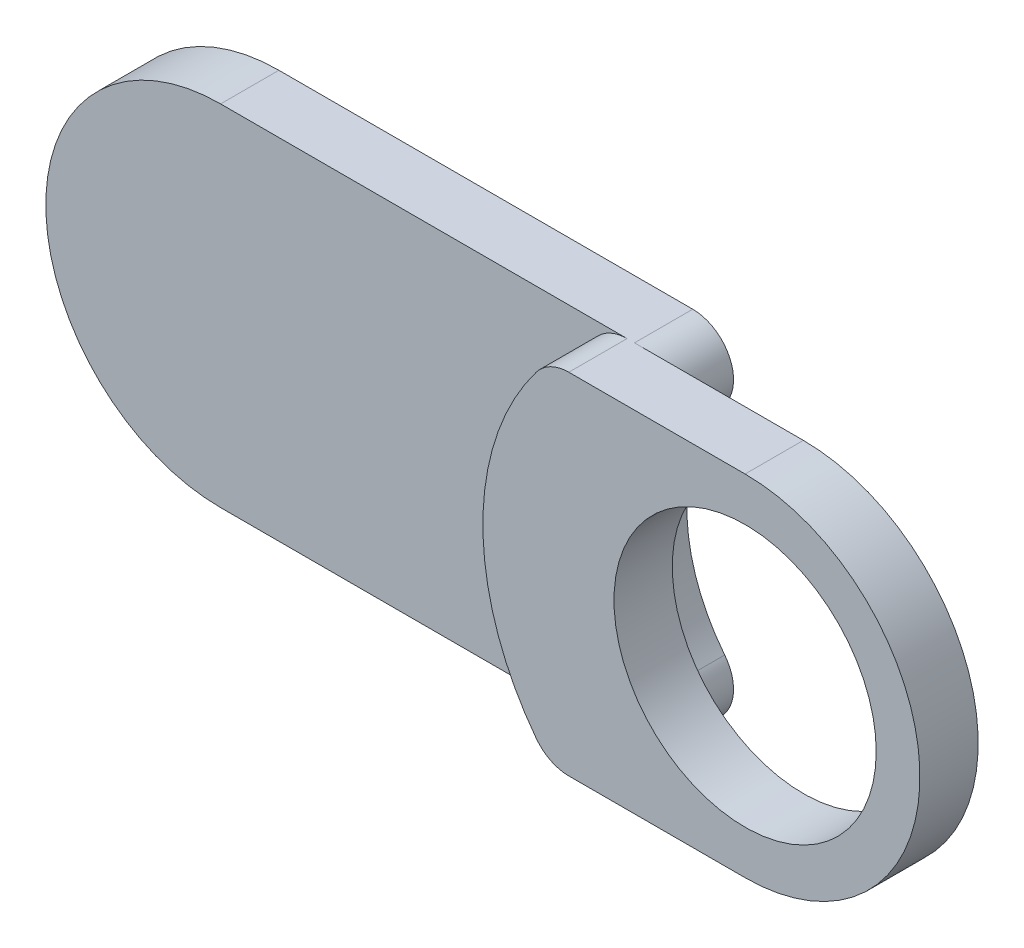
ISO-10303-21;
HEADER;
FILE_DESCRIPTION(('STEP AP214'),'2;1');
FILE_NAME('part.step','',(''),(''),'','','');
FILE_SCHEMA(('AUTOMOTIVE_DESIGN { 1 0 10303 214 1 1 1 1 }'));
ENDSEC;
DATA;
#1=APPLICATION_CONTEXT('core data for automotive mechanical design processes');
#2=APPLICATION_PROTOCOL_DEFINITION('international standard','automotive_design',2000,#1);
#3=PRODUCT_CONTEXT('',#1,'mechanical');
#4=PRODUCT('Part','Part','',(#3));
#5=PRODUCT_RELATED_PRODUCT_CATEGORY('part','',(#4));
#6=PRODUCT_DEFINITION_FORMATION('','',#4);
#7=PRODUCT_DEFINITION_CONTEXT('part definition',#1,'design');
#8=PRODUCT_DEFINITION('design','',#6,#7);
#9=PRODUCT_DEFINITION_SHAPE('','',#8);
#10=(LENGTH_UNIT() NAMED_UNIT(*) SI_UNIT(.MILLI.,.METRE.));
#11=(NAMED_UNIT(*) PLANE_ANGLE_UNIT() SI_UNIT($,.RADIAN.));
#12=(NAMED_UNIT(*) SI_UNIT($,.STERADIAN.) SOLID_ANGLE_UNIT());
#13=UNCERTAINTY_MEASURE_WITH_UNIT(LENGTH_MEASURE(1.E-05),#10,'distance_accuracy_value','');
#14=(GEOMETRIC_REPRESENTATION_CONTEXT(3) GLOBAL_UNCERTAINTY_ASSIGNED_CONTEXT((#13)) GLOBAL_UNIT_ASSIGNED_CONTEXT((#10,
#11,#12)) REPRESENTATION_CONTEXT('',''));
#15=CARTESIAN_POINT('',(0.,0.,0.));
#16=DIRECTION('',(0.,0.,1.));
#17=DIRECTION('',(1.,0.,0.));
#18=AXIS2_PLACEMENT_3D('',#15,#16,#17);
#19=CARTESIAN_POINT('',(0.,0.,1.));
#20=DIRECTION('',(0.,0.,1.));
#21=DIRECTION('',(1.,0.,0.));
#22=AXIS2_PLACEMENT_3D('',#19,#20,#21);
#23=PLANE('',#22);
#24=CARTESIAN_POINT('',(0.,0.,1.));
#25=DIRECTION('',(0.,0.,1.));
#26=DIRECTION('',(1.,0.,0.));
#27=AXIS2_PLACEMENT_3D('',#24,#25,#26);
#28=CIRCLE('',#27,2.25);
#29=CARTESIAN_POINT('',(2.25,0.,1.));
#30=VERTEX_POINT('',#29);
#31=EDGE_CURVE('E153',#30,#30,#28,.T.);
#32=ORIENTED_EDGE('',*,*,#31,.F.);
#33=EDGE_LOOP('',(#32));
#34=FACE_BOUND('',#33,.T.);
#35=CARTESIAN_POINT('',(0.,0.,1.));
#36=DIRECTION('',(0.,0.,1.));
#37=DIRECTION('',(-1.,0.,0.));
#38=AXIS2_PLACEMENT_3D('',#35,#36,#37);
#39=CIRCLE('',#38,4.5);
#40=CARTESIAN_POINT('',(-3.58211450421809,2.72368421052632,1.));
#41=VERTEX_POINT('',#40);
#42=CARTESIAN_POINT('',(-3.58211450421809,-2.72368421052632,1.));
#43=VERTEX_POINT('',#42);
#44=EDGE_CURVE('E211',#41,#43,#39,.T.);
#45=ORIENTED_EDGE('',*,*,#44,.T.);
#46=CARTESIAN_POINT('',(-3.02489669245083,-2.3,1.));
#47=DIRECTION('',(0.,0.,1.));
#48=DIRECTION('',(1.,0.,0.));
#49=AXIS2_PLACEMENT_3D('',#46,#47,#48);
#50=CIRCLE('',#49,0.7);
#51=CARTESIAN_POINT('',(-3.02489669245083,-3.,1.));
#52=VERTEX_POINT('',#51);
#53=EDGE_CURVE('E195',#43,#52,#50,.T.);
#54=ORIENTED_EDGE('',*,*,#53,.T.);
#55=DIRECTION('',(-1.,0.,0.));
#56=VECTOR('',#55,1.);
#57=CARTESIAN_POINT('',(0.,-3.,1.));
#58=LINE('',#57,#56);
#59=CARTESIAN_POINT('',(0.,-3.,1.));
#60=VERTEX_POINT('',#59);
#61=EDGE_CURVE('E216',#60,#52,#58,.T.);
#62=ORIENTED_EDGE('',*,*,#61,.F.);
#63=CARTESIAN_POINT('',(0.,0.,1.));
#64=DIRECTION('',(0.,0.,1.));
#65=DIRECTION('',(1.,0.,0.));
#66=AXIS2_PLACEMENT_3D('',#63,#64,#65);
#67=CIRCLE('',#66,3.);
#68=CARTESIAN_POINT('',(0.,3.,1.));
#69=VERTEX_POINT('',#68);
#70=EDGE_CURVE('E159',#60,#69,#67,.T.);
#71=ORIENTED_EDGE('',*,*,#70,.T.);
#72=DIRECTION('',(1.,0.,0.));
#73=VECTOR('',#72,1.);
#74=CARTESIAN_POINT('',(0.,3.,1.));
#75=LINE('',#74,#73);
#76=CARTESIAN_POINT('',(-3.02489669245083,3.,1.));
#77=VERTEX_POINT('',#76);
#78=EDGE_CURVE('E152',#77,#69,#75,.T.);
#79=ORIENTED_EDGE('',*,*,#78,.F.);
#80=CARTESIAN_POINT('',(-3.02489669245083,2.3,1.));
#81=DIRECTION('',(0.,0.,1.));
#82=DIRECTION('',(1.,0.,0.));
#83=AXIS2_PLACEMENT_3D('',#80,#81,#82);
#84=CIRCLE('',#83,0.7);
#85=EDGE_CURVE('E193',#77,#41,#84,.T.);
#86=ORIENTED_EDGE('',*,*,#85,.T.);
#87=EDGE_LOOP('',(#45,#54,#62,#71,#79,#86));
#88=FACE_BOUND('',#87,.T.);
#89=ADVANCED_FACE('F33',(#34,#88),#23,.T.);
#90=CARTESIAN_POINT('',(0.,3.,1.));
#91=DIRECTION('',(0.,1.,0.));
#92=DIRECTION('',(-1.,0.,0.));
#93=AXIS2_PLACEMENT_3D('',#90,#91,#92);
#94=PLANE('',#93);
#95=DIRECTION('',(1.,0.,0.));
#96=VECTOR('',#95,1.);
#97=CARTESIAN_POINT('',(-10.,3.,0.));
#98=LINE('',#97,#96);
#99=CARTESIAN_POINT('',(-10.,3.,0.));
#100=VERTEX_POINT('',#99);
#101=CARTESIAN_POINT('',(-3.02489669245083,3.,0.));
#102=VERTEX_POINT('',#101);
#103=EDGE_CURVE('E48',#100,#102,#98,.T.);
#104=ORIENTED_EDGE('',*,*,#103,.T.);
#105=DIRECTION('',(0.,0.,1.));
#106=VECTOR('',#105,1.);
#107=CARTESIAN_POINT('',(-3.02489669245083,3.,1.));
#108=LINE('',#107,#106);
#109=EDGE_CURVE('E199',#102,#77,#108,.T.);
#110=ORIENTED_EDGE('',*,*,#109,.T.);
#111=ORIENTED_EDGE('',*,*,#78,.T.);
#112=DIRECTION('',(0.,0.,-1.));
#113=VECTOR('',#112,1.);
#114=CARTESIAN_POINT('',(0.,3.,1.));
#115=LINE('',#114,#113);
#116=CARTESIAN_POINT('',(0.,3.,0.));
#117=VERTEX_POINT('',#116);
#118=EDGE_CURVE('E141',#69,#117,#115,.T.);
#119=ORIENTED_EDGE('',*,*,#118,.T.);
#120=DIRECTION('',(-1.,0.,0.));
#121=VECTOR('',#120,1.);
#122=CARTESIAN_POINT('',(0.,3.,0.));
#123=LINE('',#122,#121);
#124=CARTESIAN_POINT('',(-2.89827534923789,3.,0.));
#125=VERTEX_POINT('',#124);
#126=EDGE_CURVE('E179',#117,#125,#123,.T.);
#127=ORIENTED_EDGE('',*,*,#126,.T.);
#128=DIRECTION('',(0.,0.,-1.));
#129=VECTOR('',#128,1.);
#130=CARTESIAN_POINT('',(-2.89827534923789,3.,1.));
#131=LINE('',#130,#129);
#132=CARTESIAN_POINT('',(-2.89827534923789,3.,-1.));
#133=VERTEX_POINT('',#132);
#134=EDGE_CURVE('E182',#125,#133,#131,.T.);
#135=ORIENTED_EDGE('',*,*,#134,.T.);
#136=DIRECTION('',(1.,0.,0.));
#137=VECTOR('',#136,1.);
#138=CARTESIAN_POINT('',(0.,3.,-1.));
#139=LINE('',#138,#137);
#140=CARTESIAN_POINT('',(-10.,3.,-1.));
#141=VERTEX_POINT('',#140);
#142=EDGE_CURVE('E140',#141,#133,#139,.T.);
#143=ORIENTED_EDGE('',*,*,#142,.F.);
#144=DIRECTION('',(0.,0.,-1.));
#145=VECTOR('',#144,1.);
#146=CARTESIAN_POINT('',(-10.,3.,1.));
#147=LINE('',#146,#145);
#148=EDGE_CURVE('E131',#100,#141,#147,.T.);
#149=ORIENTED_EDGE('',*,*,#148,.F.);
#150=EDGE_LOOP('',(#104,#110,#111,#119,#127,#135,#143,#149));
#151=FACE_BOUND('',#150,.T.);
#152=ADVANCED_FACE('F137',(#151),#94,.T.);
#153=CARTESIAN_POINT('',(0.,-3.,1.));
#154=DIRECTION('',(0.,-1.,0.));
#155=DIRECTION('',(0.,0.,-1.));
#156=AXIS2_PLACEMENT_3D('',#153,#154,#155);
#157=PLANE('',#156);
#158=ORIENTED_EDGE('',*,*,#61,.T.);
#159=DIRECTION('',(0.,0.,1.));
#160=VECTOR('',#159,1.);
#161=CARTESIAN_POINT('',(-3.02489669245083,-3.,1.));
#162=LINE('',#161,#160);
#163=CARTESIAN_POINT('',(-3.02489669245083,-3.,0.));
#164=VERTEX_POINT('',#163);
#165=EDGE_CURVE('E197',#52,#164,#162,.F.);
#166=ORIENTED_EDGE('',*,*,#165,.T.);
#167=DIRECTION('',(-1.,0.,0.));
#168=VECTOR('',#167,1.);
#169=CARTESIAN_POINT('',(-3.35410196624968,-3.,0.));
#170=LINE('',#169,#168);
#171=CARTESIAN_POINT('',(-10.,-3.,0.));
#172=VERTEX_POINT('',#171);
#173=EDGE_CURVE('E55',#164,#172,#170,.T.);
#174=ORIENTED_EDGE('',*,*,#173,.T.);
#175=DIRECTION('',(0.,0.,-1.));
#176=VECTOR('',#175,1.);
#177=CARTESIAN_POINT('',(-10.,-3.,1.));
#178=LINE('',#177,#176);
#179=CARTESIAN_POINT('',(-10.,-3.,-1.));
#180=VERTEX_POINT('',#179);
#181=EDGE_CURVE('E134',#172,#180,#178,.T.);
#182=ORIENTED_EDGE('',*,*,#181,.T.);
#183=DIRECTION('',(-1.,0.,0.));
#184=VECTOR('',#183,1.);
#185=CARTESIAN_POINT('',(0.,-3.,-1.));
#186=LINE('',#185,#184);
#187=CARTESIAN_POINT('',(-2.89827534923789,-3.,-1.));
#188=VERTEX_POINT('',#187);
#189=EDGE_CURVE('E226',#188,#180,#186,.T.);
#190=ORIENTED_EDGE('',*,*,#189,.F.);
#191=DIRECTION('',(0.,0.,-1.));
#192=VECTOR('',#191,1.);
#193=CARTESIAN_POINT('',(-2.89827534923789,-3.,1.));
#194=LINE('',#193,#192);
#195=CARTESIAN_POINT('',(-2.89827534923789,-3.,0.));
#196=VERTEX_POINT('',#195);
#197=EDGE_CURVE('E176',#188,#196,#194,.F.);
#198=ORIENTED_EDGE('',*,*,#197,.T.);
#199=DIRECTION('',(1.,0.,0.));
#200=VECTOR('',#199,1.);
#201=CARTESIAN_POINT('',(0.,-3.,0.));
#202=LINE('',#201,#200);
#203=CARTESIAN_POINT('',(0.,-3.,0.));
#204=VERTEX_POINT('',#203);
#205=EDGE_CURVE('E174',#196,#204,#202,.T.);
#206=ORIENTED_EDGE('',*,*,#205,.T.);
#207=DIRECTION('',(0.,0.,-1.));
#208=VECTOR('',#207,1.);
#209=CARTESIAN_POINT('',(0.,-3.,1.));
#210=LINE('',#209,#208);
#211=EDGE_CURVE('E146',#60,#204,#210,.T.);
#212=ORIENTED_EDGE('',*,*,#211,.F.);
#213=EDGE_LOOP('',(#158,#166,#174,#182,#190,#198,#206,#212));
#214=FACE_BOUND('',#213,.T.);
#215=ADVANCED_FACE('F219',(#214),#157,.T.);
#216=CARTESIAN_POINT('',(0.,0.,1.));
#217=DIRECTION('',(0.,0.,-1.));
#218=DIRECTION('',(-1.,0.,0.));
#219=AXIS2_PLACEMENT_3D('',#216,#217,#218);
#220=CYLINDRICAL_SURFACE('',#219,3.);
#221=ORIENTED_EDGE('',*,*,#118,.F.);
#222=ORIENTED_EDGE('',*,*,#70,.F.);
#223=ORIENTED_EDGE('',*,*,#211,.T.);
#224=CARTESIAN_POINT('',(0.,0.,0.));
#225=DIRECTION('',(0.,0.,1.));
#226=DIRECTION('',(1.,0.,0.));
#227=AXIS2_PLACEMENT_3D('',#224,#225,#226);
#228=CIRCLE('',#227,3.);
#229=EDGE_CURVE('E156',#204,#117,#228,.T.);
#230=ORIENTED_EDGE('',*,*,#229,.T.);
#231=EDGE_LOOP('',(#221,#222,#223,#230));
#232=FACE_BOUND('',#231,.T.);
#233=ADVANCED_FACE('F255',(#232),#220,.T.);
#234=CARTESIAN_POINT('',(0.,0.,0.));
#235=DIRECTION('',(0.,0.,1.));
#236=DIRECTION('',(1.,0.,0.));
#237=AXIS2_PLACEMENT_3D('',#234,#235,#236);
#238=PLANE('',#237);
#239=CARTESIAN_POINT('',(-2.34995298586856,1.86486486486486,0.));
#240=VERTEX_POINT('',#239);
#241=CARTESIAN_POINT('',(-2.34995298586856,-1.86486486486486,0.));
#242=VERTEX_POINT('',#241);
#243=EDGE_CURVE('E163',#240,#242,#228,.T.);
#244=ORIENTED_EDGE('',*,*,#243,.F.);
#245=CARTESIAN_POINT('',(-2.89827534923789,2.3,0.));
#246=DIRECTION('',(0.,0.,1.));
#247=DIRECTION('',(1.,0.,0.));
#248=AXIS2_PLACEMENT_3D('',#245,#246,#247);
#249=CIRCLE('',#248,0.7);
#250=EDGE_CURVE('E186',#240,#125,#249,.T.);
#251=ORIENTED_EDGE('',*,*,#250,.T.);
#252=ORIENTED_EDGE('',*,*,#126,.F.);
#253=ORIENTED_EDGE('',*,*,#229,.F.);
#254=ORIENTED_EDGE('',*,*,#205,.F.);
#255=CARTESIAN_POINT('',(-2.89827534923789,-2.3,0.));
#256=DIRECTION('',(0.,0.,1.));
#257=DIRECTION('',(1.,0.,0.));
#258=AXIS2_PLACEMENT_3D('',#255,#256,#257);
#259=CIRCLE('',#258,0.7);
#260=EDGE_CURVE('E184',#196,#242,#259,.T.);
#261=ORIENTED_EDGE('',*,*,#260,.T.);
#262=EDGE_LOOP('',(#244,#251,#252,#253,#254,#261));
#263=FACE_BOUND('',#262,.T.);
#264=CARTESIAN_POINT('',(0.,0.,0.));
#265=DIRECTION('',(0.,0.,1.));
#266=DIRECTION('',(1.,0.,0.));
#267=AXIS2_PLACEMENT_3D('',#264,#265,#266);
#268=CIRCLE('',#267,2.25);
#269=CARTESIAN_POINT('',(2.25,0.,0.));
#270=VERTEX_POINT('',#269);
#271=EDGE_CURVE('E144',#270,#270,#268,.T.);
#272=ORIENTED_EDGE('',*,*,#271,.T.);
#273=EDGE_LOOP('',(#272));
#274=FACE_BOUND('',#273,.T.);
#275=ADVANCED_FACE('F246',(#263,#274),#238,.F.);
#276=CARTESIAN_POINT('',(0.,0.,1.));
#277=DIRECTION('',(0.,0.,-1.));
#278=DIRECTION('',(-1.,0.,0.));
#279=AXIS2_PLACEMENT_3D('',#276,#277,#278);
#280=CYLINDRICAL_SURFACE('',#279,2.25);
#281=ORIENTED_EDGE('',*,*,#31,.T.);
#282=EDGE_LOOP('',(#281));
#283=FACE_BOUND('',#282,.T.);
#284=ORIENTED_EDGE('',*,*,#271,.F.);
#285=EDGE_LOOP('',(#284));
#286=FACE_BOUND('',#285,.T.);
#287=ADVANCED_FACE('F273',(#283,#286),#280,.F.);
#288=CARTESIAN_POINT('',(0.,0.,1.));
#289=DIRECTION('',(0.,0.,-1.));
#290=DIRECTION('',(-1.,0.,0.));
#291=AXIS2_PLACEMENT_3D('',#288,#289,#290);
#292=CYLINDRICAL_SURFACE('',#291,3.);
#293=ORIENTED_EDGE('',*,*,#243,.T.);
#294=DIRECTION('',(0.,0.,-1.));
#295=VECTOR('',#294,1.);
#296=CARTESIAN_POINT('',(-2.34995298586856,-1.86486486486487,1.));
#297=LINE('',#296,#295);
#298=CARTESIAN_POINT('',(-2.34995298586856,-1.86486486486486,-1.));
#299=VERTEX_POINT('',#298);
#300=EDGE_CURVE('E167',#242,#299,#297,.T.);
#301=ORIENTED_EDGE('',*,*,#300,.T.);
#302=CARTESIAN_POINT('',(0.,0.,-1.));
#303=DIRECTION('',(0.,0.,1.));
#304=DIRECTION('',(-1.,0.,0.));
#305=AXIS2_PLACEMENT_3D('',#302,#303,#304);
#306=CIRCLE('',#305,3.);
#307=CARTESIAN_POINT('',(-2.34995298586856,1.86486486486486,-1.));
#308=VERTEX_POINT('',#307);
#309=EDGE_CURVE('E125',#308,#299,#306,.T.);
#310=ORIENTED_EDGE('',*,*,#309,.F.);
#311=DIRECTION('',(0.,0.,-1.));
#312=VECTOR('',#311,1.);
#313=CARTESIAN_POINT('',(-2.34995298586856,1.86486486486487,1.));
#314=LINE('',#313,#312);
#315=EDGE_CURVE('E162',#308,#240,#314,.F.);
#316=ORIENTED_EDGE('',*,*,#315,.T.);
#317=EDGE_LOOP('',(#293,#301,#310,#316));
#318=FACE_BOUND('',#317,.T.);
#319=ADVANCED_FACE('F241',(#318),#292,.F.);
#320=CARTESIAN_POINT('',(-10.,0.,1.));
#321=DIRECTION('',(0.,0.,-1.));
#322=DIRECTION('',(-1.,0.,0.));
#323=AXIS2_PLACEMENT_3D('',#320,#321,#322);
#324=CYLINDRICAL_SURFACE('',#323,3.);
#325=CARTESIAN_POINT('',(-10.,0.,0.));
#326=DIRECTION('',(0.,0.,-1.));
#327=DIRECTION('',(-1.,0.,0.));
#328=AXIS2_PLACEMENT_3D('',#325,#326,#327);
#329=CIRCLE('',#328,3.);
#330=EDGE_CURVE('E122',#172,#100,#329,.T.);
#331=ORIENTED_EDGE('',*,*,#330,.T.);
#332=ORIENTED_EDGE('',*,*,#148,.T.);
#333=CARTESIAN_POINT('',(-10.,0.,-1.));
#334=DIRECTION('',(0.,0.,-1.));
#335=DIRECTION('',(-1.,0.,0.));
#336=AXIS2_PLACEMENT_3D('',#333,#334,#335);
#337=CIRCLE('',#336,3.);
#338=EDGE_CURVE('E222',#180,#141,#337,.T.);
#339=ORIENTED_EDGE('',*,*,#338,.F.);
#340=ORIENTED_EDGE('',*,*,#181,.F.);
#341=EDGE_LOOP('',(#331,#332,#339,#340));
#342=FACE_BOUND('',#341,.T.);
#343=ADVANCED_FACE('F129',(#342),#324,.T.);
#344=CARTESIAN_POINT('',(0.,0.,-1.));
#345=DIRECTION('',(0.,0.,-1.));
#346=DIRECTION('',(-1.,0.,0.));
#347=AXIS2_PLACEMENT_3D('',#344,#345,#346);
#348=PLANE('',#347);
#349=ORIENTED_EDGE('',*,*,#309,.T.);
#350=CARTESIAN_POINT('',(-2.89827534923789,-2.3,-1.));
#351=DIRECTION('',(0.,0.,-1.));
#352=DIRECTION('',(-1.,0.,0.));
#353=AXIS2_PLACEMENT_3D('',#350,#351,#352);
#354=CIRCLE('',#353,0.7);
#355=EDGE_CURVE('E172',#299,#188,#354,.T.);
#356=ORIENTED_EDGE('',*,*,#355,.T.);
#357=ORIENTED_EDGE('',*,*,#189,.T.);
#358=ORIENTED_EDGE('',*,*,#338,.T.);
#359=ORIENTED_EDGE('',*,*,#142,.T.);
#360=CARTESIAN_POINT('',(-2.89827534923789,2.3,-1.));
#361=DIRECTION('',(0.,0.,-1.));
#362=DIRECTION('',(-1.,0.,0.));
#363=AXIS2_PLACEMENT_3D('',#360,#361,#362);
#364=CIRCLE('',#363,0.7);
#365=EDGE_CURVE('E170',#133,#308,#364,.T.);
#366=ORIENTED_EDGE('',*,*,#365,.T.);
#367=EDGE_LOOP('',(#349,#356,#357,#358,#359,#366));
#368=FACE_BOUND('',#367,.T.);
#369=ADVANCED_FACE('F234',(#368),#348,.T.);
#370=CARTESIAN_POINT('',(0.,0.,0.));
#371=DIRECTION('',(0.,0.,1.));
#372=DIRECTION('',(1.,0.,0.));
#373=AXIS2_PLACEMENT_3D('',#370,#371,#372);
#374=CYLINDRICAL_SURFACE('',#373,4.5);
#375=CARTESIAN_POINT('',(0.,0.,0.));
#376=DIRECTION('',(0.,0.,1.));
#377=DIRECTION('',(-1.,0.,0.));
#378=AXIS2_PLACEMENT_3D('',#375,#376,#377);
#379=CIRCLE('',#378,4.5);
#380=CARTESIAN_POINT('',(-3.58211450421809,2.72368421052632,0.));
#381=VERTEX_POINT('',#380);
#382=CARTESIAN_POINT('',(-3.58211450421809,-2.72368421052632,0.));
#383=VERTEX_POINT('',#382);
#384=EDGE_CURVE('E202',#381,#383,#379,.T.);
#385=ORIENTED_EDGE('',*,*,#384,.T.);
#386=DIRECTION('',(0.,0.,1.));
#387=VECTOR('',#386,1.);
#388=CARTESIAN_POINT('',(-3.58211450421809,-2.72368421052632,0.));
#389=LINE('',#388,#387);
#390=EDGE_CURVE('E190',#383,#43,#389,.T.);
#391=ORIENTED_EDGE('',*,*,#390,.T.);
#392=ORIENTED_EDGE('',*,*,#44,.F.);
#393=DIRECTION('',(0.,0.,1.));
#394=VECTOR('',#393,1.);
#395=CARTESIAN_POINT('',(-3.58211450421809,2.72368421052632,0.));
#396=LINE('',#395,#394);
#397=EDGE_CURVE('E188',#41,#381,#396,.F.);
#398=ORIENTED_EDGE('',*,*,#397,.T.);
#399=EDGE_LOOP('',(#385,#391,#392,#398));
#400=FACE_BOUND('',#399,.T.);
#401=ADVANCED_FACE('F207',(#400),#374,.T.);
#402=CARTESIAN_POINT('',(0.,0.,0.));
#403=DIRECTION('',(0.,0.,-1.));
#404=DIRECTION('',(-1.,0.,0.));
#405=AXIS2_PLACEMENT_3D('',#402,#403,#404);
#406=PLANE('',#405);
#407=ORIENTED_EDGE('',*,*,#384,.F.);
#408=CARTESIAN_POINT('',(-3.02489669245083,2.3,0.));
#409=DIRECTION('',(0.,0.,-1.));
#410=DIRECTION('',(-1.,0.,0.));
#411=AXIS2_PLACEMENT_3D('',#408,#409,#410);
#412=CIRCLE('',#411,0.7);
#413=EDGE_CURVE('E11',#381,#102,#412,.T.);
#414=ORIENTED_EDGE('',*,*,#413,.T.);
#415=ORIENTED_EDGE('',*,*,#103,.F.);
#416=ORIENTED_EDGE('',*,*,#330,.F.);
#417=ORIENTED_EDGE('',*,*,#173,.F.);
#418=CARTESIAN_POINT('',(-3.02489669245083,-2.3,0.));
#419=DIRECTION('',(0.,0.,-1.));
#420=DIRECTION('',(-1.,0.,0.));
#421=AXIS2_PLACEMENT_3D('',#418,#419,#420);
#422=CIRCLE('',#421,0.7);
#423=EDGE_CURVE('E41',#164,#383,#422,.T.);
#424=ORIENTED_EDGE('',*,*,#423,.T.);
#425=EDGE_LOOP('',(#407,#414,#415,#416,#417,#424));
#426=FACE_BOUND('',#425,.T.);
#427=ADVANCED_FACE('F121',(#426),#406,.F.);
#428=CARTESIAN_POINT('',(-2.89827534923789,-2.3,1.));
#429=DIRECTION('',(0.,0.,-1.));
#430=DIRECTION('',(-1.,0.,0.));
#431=AXIS2_PLACEMENT_3D('',#428,#429,#430);
#432=CYLINDRICAL_SURFACE('',#431,0.7);
#433=ORIENTED_EDGE('',*,*,#260,.F.);
#434=ORIENTED_EDGE('',*,*,#197,.F.);
#435=ORIENTED_EDGE('',*,*,#355,.F.);
#436=ORIENTED_EDGE('',*,*,#300,.F.);
#437=EDGE_LOOP('',(#433,#434,#435,#436));
#438=FACE_BOUND('',#437,.T.);
#439=ADVANCED_FACE('F239',(#438),#432,.T.);
#440=CARTESIAN_POINT('',(-2.89827534923789,2.3,1.));
#441=DIRECTION('',(0.,0.,-1.));
#442=DIRECTION('',(-1.,0.,0.));
#443=AXIS2_PLACEMENT_3D('',#440,#441,#442);
#444=CYLINDRICAL_SURFACE('',#443,0.7);
#445=ORIENTED_EDGE('',*,*,#250,.F.);
#446=ORIENTED_EDGE('',*,*,#315,.F.);
#447=ORIENTED_EDGE('',*,*,#365,.F.);
#448=ORIENTED_EDGE('',*,*,#134,.F.);
#449=EDGE_LOOP('',(#445,#446,#447,#448));
#450=FACE_BOUND('',#449,.T.);
#451=ADVANCED_FACE('F250',(#450),#444,.T.);
#452=CARTESIAN_POINT('',(-3.02489669245083,-2.3,0.));
#453=DIRECTION('',(0.,0.,1.));
#454=DIRECTION('',(1.,0.,0.));
#455=AXIS2_PLACEMENT_3D('',#452,#453,#454);
#456=CYLINDRICAL_SURFACE('',#455,0.7);
#457=ORIENTED_EDGE('',*,*,#423,.F.);
#458=ORIENTED_EDGE('',*,*,#165,.F.);
#459=ORIENTED_EDGE('',*,*,#53,.F.);
#460=ORIENTED_EDGE('',*,*,#390,.F.);
#461=EDGE_LOOP('',(#457,#458,#459,#460));
#462=FACE_BOUND('',#461,.T.);
#463=ADVANCED_FACE('F213',(#462),#456,.T.);
#464=CARTESIAN_POINT('',(-3.02489669245083,2.3,0.));
#465=DIRECTION('',(0.,0.,1.));
#466=DIRECTION('',(1.,0.,0.));
#467=AXIS2_PLACEMENT_3D('',#464,#465,#466);
#468=CYLINDRICAL_SURFACE('',#467,0.7);
#469=ORIENTED_EDGE('',*,*,#413,.F.);
#470=ORIENTED_EDGE('',*,*,#397,.F.);
#471=ORIENTED_EDGE('',*,*,#85,.F.);
#472=ORIENTED_EDGE('',*,*,#109,.F.);
#473=EDGE_LOOP('',(#469,#470,#471,#472));
#474=FACE_BOUND('',#473,.T.);
#475=ADVANCED_FACE('F35',(#474),#468,.T.);
#476=CLOSED_SHELL('',(#89,#152,#215,#233,#275,#287,#319,#343,#369,#401,#427,#439,#451,#463,#475));
#477=MANIFOLD_SOLID_BREP('B2',#476);
#478=ADVANCED_BREP_SHAPE_REPRESENTATION('',(#18,#477),#14);
#479=SHAPE_DEFINITION_REPRESENTATION(#9,#478);
ENDSEC;
END-ISO-10303-21;
